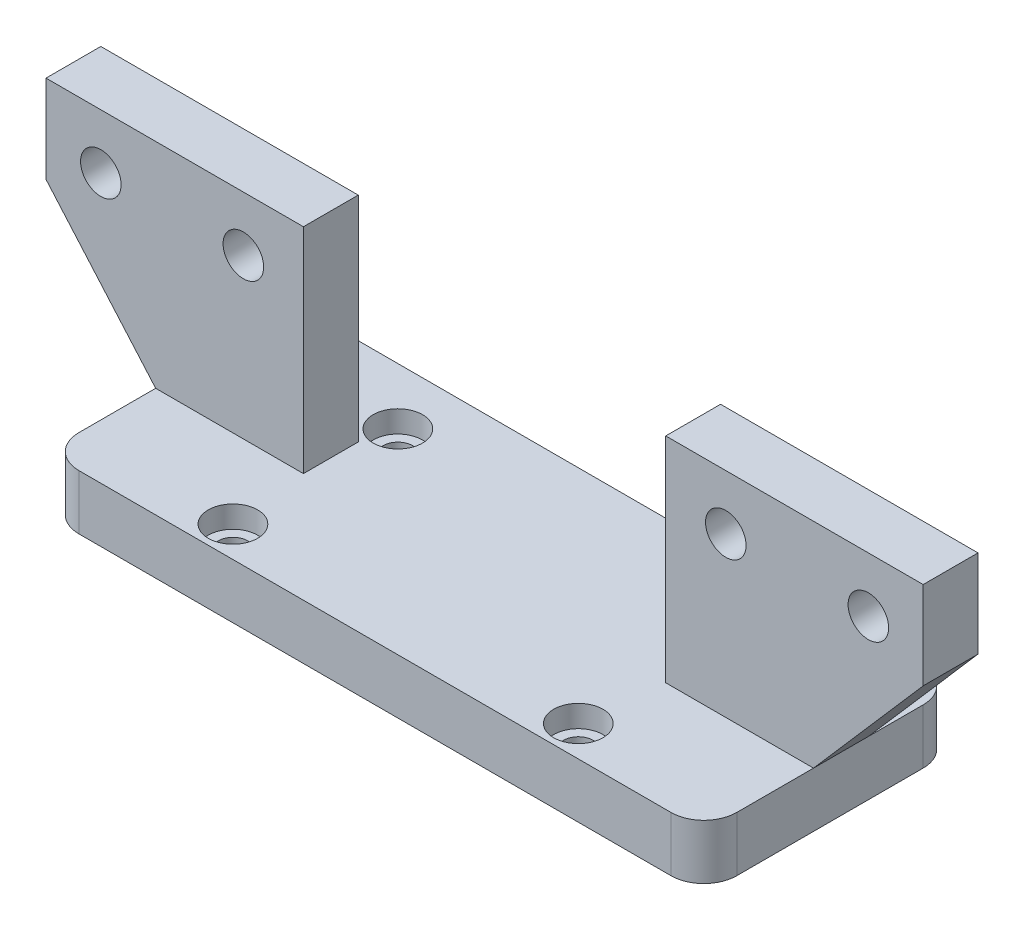
ISO-10303-21;
HEADER;
FILE_DESCRIPTION(('STEP AP214'),'2;1');
FILE_NAME('part.step','',(''),(''),'','','');
FILE_SCHEMA(('AUTOMOTIVE_DESIGN { 1 0 10303 214 1 1 1 1 }'));
ENDSEC;
DATA;
#1=APPLICATION_CONTEXT('core data for automotive mechanical design processes');
#2=APPLICATION_PROTOCOL_DEFINITION('international standard','automotive_design',2000,#1);
#3=PRODUCT_CONTEXT('',#1,'mechanical');
#4=PRODUCT('Part','Part','',(#3));
#5=PRODUCT_RELATED_PRODUCT_CATEGORY('part','',(#4));
#6=PRODUCT_DEFINITION_FORMATION('','',#4);
#7=PRODUCT_DEFINITION_CONTEXT('part definition',#1,'design');
#8=PRODUCT_DEFINITION('design','',#6,#7);
#9=PRODUCT_DEFINITION_SHAPE('','',#8);
#10=(LENGTH_UNIT() NAMED_UNIT(*) SI_UNIT(.MILLI.,.METRE.));
#11=(NAMED_UNIT(*) PLANE_ANGLE_UNIT() SI_UNIT($,.RADIAN.));
#12=(NAMED_UNIT(*) SI_UNIT($,.STERADIAN.) SOLID_ANGLE_UNIT());
#13=UNCERTAINTY_MEASURE_WITH_UNIT(LENGTH_MEASURE(1.E-05),#10,'distance_accuracy_value','');
#14=(GEOMETRIC_REPRESENTATION_CONTEXT(3) GLOBAL_UNCERTAINTY_ASSIGNED_CONTEXT((#13)) GLOBAL_UNIT_ASSIGNED_CONTEXT((#10,
#11,#12)) REPRESENTATION_CONTEXT('',''));
#15=CARTESIAN_POINT('',(0.,0.,0.));
#16=DIRECTION('',(0.,0.,1.));
#17=DIRECTION('',(1.,0.,0.));
#18=AXIS2_PLACEMENT_3D('',#15,#16,#17);
#19=CARTESIAN_POINT('',(-15.75,24.5,8.7));
#20=DIRECTION('',(0.,-1.,0.));
#21=DIRECTION('',(0.,0.,-1.));
#22=AXIS2_PLACEMENT_3D('',#19,#20,#21);
#23=CYLINDRICAL_SURFACE('',#22,1.35);
#24=CARTESIAN_POINT('',(-15.75,0.,8.7));
#25=DIRECTION('',(0.,-1.,0.));
#26=DIRECTION('',(0.,0.,-1.));
#27=AXIS2_PLACEMENT_3D('',#24,#25,#26);
#28=CIRCLE('',#27,1.35);
#29=CARTESIAN_POINT('',(-15.75,0.,7.35));
#30=VERTEX_POINT('',#29);
#31=EDGE_CURVE('E661',#30,#30,#28,.T.);
#32=ORIENTED_EDGE('',*,*,#31,.T.);
#33=EDGE_LOOP('',(#32));
#34=FACE_BOUND('',#33,.T.);
#35=CARTESIAN_POINT('',(-15.75,3.,8.7));
#36=DIRECTION('',(0.,1.,0.));
#37=DIRECTION('',(0.,0.,1.));
#38=AXIS2_PLACEMENT_3D('',#35,#36,#37);
#39=CIRCLE('',#38,1.35);
#40=CARTESIAN_POINT('',(-15.75,3.,10.05));
#41=VERTEX_POINT('',#40);
#42=EDGE_CURVE('E231',#41,#41,#39,.F.);
#43=ORIENTED_EDGE('',*,*,#42,.F.);
#44=EDGE_LOOP('',(#43));
#45=FACE_BOUND('',#44,.T.);
#46=ADVANCED_FACE('F34',(#34,#45),#23,.F.);
#47=CARTESIAN_POINT('',(15.75,24.5,8.7));
#48=DIRECTION('',(0.,-1.,0.));
#49=DIRECTION('',(0.,0.,-1.));
#50=AXIS2_PLACEMENT_3D('',#47,#48,#49);
#51=CYLINDRICAL_SURFACE('',#50,1.35);
#52=CARTESIAN_POINT('',(15.75,0.,8.7));
#53=DIRECTION('',(0.,-1.,0.));
#54=DIRECTION('',(0.,0.,-1.));
#55=AXIS2_PLACEMENT_3D('',#52,#53,#54);
#56=CIRCLE('',#55,1.35);
#57=CARTESIAN_POINT('',(15.75,0.,7.35));
#58=VERTEX_POINT('',#57);
#59=EDGE_CURVE('E657',#58,#58,#56,.T.);
#60=ORIENTED_EDGE('',*,*,#59,.T.);
#61=EDGE_LOOP('',(#60));
#62=FACE_BOUND('',#61,.T.);
#63=CARTESIAN_POINT('',(15.75,3.,8.7));
#64=DIRECTION('',(0.,1.,0.));
#65=DIRECTION('',(0.,0.,1.));
#66=AXIS2_PLACEMENT_3D('',#63,#64,#65);
#67=CIRCLE('',#66,1.35);
#68=CARTESIAN_POINT('',(15.75,3.,10.05));
#69=VERTEX_POINT('',#68);
#70=EDGE_CURVE('E228',#69,#69,#67,.F.);
#71=ORIENTED_EDGE('',*,*,#70,.F.);
#72=EDGE_LOOP('',(#71));
#73=FACE_BOUND('',#72,.T.);
#74=ADVANCED_FACE('F300',(#62,#73),#51,.F.);
#75=CARTESIAN_POINT('',(15.75,24.5,-6.34));
#76=DIRECTION('',(0.,-1.,0.));
#77=DIRECTION('',(0.,0.,-1.));
#78=AXIS2_PLACEMENT_3D('',#75,#76,#77);
#79=CYLINDRICAL_SURFACE('',#78,1.35);
#80=CARTESIAN_POINT('',(15.75,0.,-6.34));
#81=DIRECTION('',(0.,-1.,0.));
#82=DIRECTION('',(0.,0.,-1.));
#83=AXIS2_PLACEMENT_3D('',#80,#81,#82);
#84=CIRCLE('',#83,1.35);
#85=CARTESIAN_POINT('',(15.75,0.,-7.69));
#86=VERTEX_POINT('',#85);
#87=EDGE_CURVE('E654',#86,#86,#84,.T.);
#88=ORIENTED_EDGE('',*,*,#87,.T.);
#89=EDGE_LOOP('',(#88));
#90=FACE_BOUND('',#89,.T.);
#91=CARTESIAN_POINT('',(15.75,3.,-6.34));
#92=DIRECTION('',(0.,1.,0.));
#93=DIRECTION('',(0.,0.,1.));
#94=AXIS2_PLACEMENT_3D('',#91,#92,#93);
#95=CIRCLE('',#94,1.35);
#96=CARTESIAN_POINT('',(15.75,3.,-4.99));
#97=VERTEX_POINT('',#96);
#98=EDGE_CURVE('E224',#97,#97,#95,.F.);
#99=ORIENTED_EDGE('',*,*,#98,.F.);
#100=EDGE_LOOP('',(#99));
#101=FACE_BOUND('',#100,.T.);
#102=ADVANCED_FACE('F306',(#90,#101),#79,.F.);
#103=CARTESIAN_POINT('',(-15.75,24.5,-6.34));
#104=DIRECTION('',(0.,-1.,0.));
#105=DIRECTION('',(0.,0.,-1.));
#106=AXIS2_PLACEMENT_3D('',#103,#104,#105);
#107=CYLINDRICAL_SURFACE('',#106,1.35);
#108=CARTESIAN_POINT('',(-15.75,0.,-6.34));
#109=DIRECTION('',(0.,-1.,0.));
#110=DIRECTION('',(0.,0.,-1.));
#111=AXIS2_PLACEMENT_3D('',#108,#109,#110);
#112=CIRCLE('',#111,1.35);
#113=CARTESIAN_POINT('',(-15.75,0.,-7.69));
#114=VERTEX_POINT('',#113);
#115=EDGE_CURVE('E234',#114,#114,#112,.T.);
#116=ORIENTED_EDGE('',*,*,#115,.T.);
#117=EDGE_LOOP('',(#116));
#118=FACE_BOUND('',#117,.T.);
#119=CARTESIAN_POINT('',(-15.75,3.,-6.34));
#120=DIRECTION('',(0.,1.,0.));
#121=DIRECTION('',(0.,0.,1.));
#122=AXIS2_PLACEMENT_3D('',#119,#120,#121);
#123=CIRCLE('',#122,1.35);
#124=CARTESIAN_POINT('',(-15.75,3.,-4.99));
#125=VERTEX_POINT('',#124);
#126=EDGE_CURVE('E221',#125,#125,#123,.F.);
#127=ORIENTED_EDGE('',*,*,#126,.F.);
#128=EDGE_LOOP('',(#127));
#129=FACE_BOUND('',#128,.T.);
#130=ADVANCED_FACE('F313',(#118,#129),#107,.F.);
#131=CARTESIAN_POINT('',(0.,5.,0.));
#132=DIRECTION('',(0.,-1.,0.));
#133=DIRECTION('',(0.,0.,-1.));
#134=AXIS2_PLACEMENT_3D('',#131,#132,#133);
#135=PLANE('',#134);
#136=CARTESIAN_POINT('',(-15.75,5.,-6.34));
#137=DIRECTION('',(0.,1.,0.));
#138=DIRECTION('',(0.,0.,1.));
#139=AXIS2_PLACEMENT_3D('',#136,#137,#138);
#140=CIRCLE('',#139,2.25);
#141=CARTESIAN_POINT('',(-15.75,5.,-4.09));
#142=VERTEX_POINT('',#141);
#143=EDGE_CURVE('E790',#142,#142,#140,.T.);
#144=ORIENTED_EDGE('',*,*,#143,.F.);
#145=EDGE_LOOP('',(#144));
#146=FACE_BOUND('',#145,.T.);
#147=CARTESIAN_POINT('',(-15.75,5.,8.7));
#148=DIRECTION('',(0.,1.,0.));
#149=DIRECTION('',(0.,0.,1.));
#150=AXIS2_PLACEMENT_3D('',#147,#148,#149);
#151=CIRCLE('',#150,2.25);
#152=CARTESIAN_POINT('',(-15.75,5.,10.95));
#153=VERTEX_POINT('',#152);
#154=EDGE_CURVE('E796',#153,#153,#151,.T.);
#155=ORIENTED_EDGE('',*,*,#154,.F.);
#156=EDGE_LOOP('',(#155));
#157=FACE_BOUND('',#156,.T.);
#158=CARTESIAN_POINT('',(15.75,5.,8.7));
#159=DIRECTION('',(0.,1.,0.));
#160=DIRECTION('',(0.,0.,1.));
#161=AXIS2_PLACEMENT_3D('',#158,#159,#160);
#162=CIRCLE('',#161,2.25);
#163=CARTESIAN_POINT('',(15.75,5.,10.95));
#164=VERTEX_POINT('',#163);
#165=EDGE_CURVE('E802',#164,#164,#162,.T.);
#166=ORIENTED_EDGE('',*,*,#165,.F.);
#167=EDGE_LOOP('',(#166));
#168=FACE_BOUND('',#167,.T.);
#169=CARTESIAN_POINT('',(15.75,5.,-6.34));
#170=DIRECTION('',(0.,1.,0.));
#171=DIRECTION('',(0.,0.,1.));
#172=AXIS2_PLACEMENT_3D('',#169,#170,#171);
#173=CIRCLE('',#172,2.25);
#174=CARTESIAN_POINT('',(15.75,5.,-4.09));
#175=VERTEX_POINT('',#174);
#176=EDGE_CURVE('E784',#175,#175,#173,.T.);
#177=ORIENTED_EDGE('',*,*,#176,.F.);
#178=EDGE_LOOP('',(#177));
#179=FACE_BOUND('',#178,.T.);
#180=DIRECTION('',(0.,0.,-1.));
#181=VECTOR('',#180,1.);
#182=CARTESIAN_POINT('',(30.,5.,11.5));
#183=LINE('',#182,#181);
#184=CARTESIAN_POINT('',(30.,5.,-3.5));
#185=VERTEX_POINT('',#184);
#186=CARTESIAN_POINT('',(30.,5.,-8.5));
#187=VERTEX_POINT('',#186);
#188=EDGE_CURVE('E185',#185,#187,#183,.T.);
#189=ORIENTED_EDGE('',*,*,#188,.T.);
#190=CARTESIAN_POINT('',(27.,5.,-8.5));
#191=DIRECTION('',(0.,-1.,0.));
#192=DIRECTION('',(0.,0.,-1.));
#193=AXIS2_PLACEMENT_3D('',#190,#191,#192);
#194=CIRCLE('',#193,3.);
#195=CARTESIAN_POINT('',(27.,5.,-11.5));
#196=VERTEX_POINT('',#195);
#197=EDGE_CURVE('E256',#187,#196,#194,.F.);
#198=ORIENTED_EDGE('',*,*,#197,.T.);
#199=DIRECTION('',(-1.,0.,0.));
#200=VECTOR('',#199,1.);
#201=CARTESIAN_POINT('',(-30.,5.,-11.5));
#202=LINE('',#201,#200);
#203=CARTESIAN_POINT('',(-27.,5.,-11.5));
#204=VERTEX_POINT('',#203);
#205=EDGE_CURVE('E198',#196,#204,#202,.T.);
#206=ORIENTED_EDGE('',*,*,#205,.T.);
#207=CARTESIAN_POINT('',(-27.,5.,-8.5));
#208=DIRECTION('',(0.,-1.,0.));
#209=DIRECTION('',(0.,0.,-1.));
#210=AXIS2_PLACEMENT_3D('',#207,#208,#209);
#211=CIRCLE('',#210,3.);
#212=CARTESIAN_POINT('',(-30.,5.,-8.5));
#213=VERTEX_POINT('',#212);
#214=EDGE_CURVE('E254',#204,#213,#211,.F.);
#215=ORIENTED_EDGE('',*,*,#214,.T.);
#216=DIRECTION('',(0.,0.,1.));
#217=VECTOR('',#216,1.);
#218=CARTESIAN_POINT('',(-30.,5.,11.5));
#219=LINE('',#218,#217);
#220=CARTESIAN_POINT('',(-30.,5.,-3.5));
#221=VERTEX_POINT('',#220);
#222=EDGE_CURVE('E208',#213,#221,#219,.T.);
#223=ORIENTED_EDGE('',*,*,#222,.T.);
#224=DIRECTION('',(-1.,0.,0.));
#225=VECTOR('',#224,1.);
#226=CARTESIAN_POINT('',(0.,5.,-3.5));
#227=LINE('',#226,#225);
#228=CARTESIAN_POINT('',(-16.5216368519485,5.,-3.5));
#229=VERTEX_POINT('',#228);
#230=EDGE_CURVE('E700',#229,#221,#227,.T.);
#231=ORIENTED_EDGE('',*,*,#230,.F.);
#232=DIRECTION('',(0.,0.,1.));
#233=VECTOR('',#232,1.);
#234=CARTESIAN_POINT('',(-16.5216368519485,5.,-3.5));
#235=LINE('',#234,#233);
#236=CARTESIAN_POINT('',(-16.5216368519485,5.,1.5));
#237=VERTEX_POINT('',#236);
#238=EDGE_CURVE('E203',#229,#237,#235,.T.);
#239=ORIENTED_EDGE('',*,*,#238,.T.);
#240=DIRECTION('',(-1.,0.,0.));
#241=VECTOR('',#240,1.);
#242=CARTESIAN_POINT('',(0.,5.,1.5));
#243=LINE('',#242,#241);
#244=CARTESIAN_POINT('',(-30.,5.,1.5));
#245=VERTEX_POINT('',#244);
#246=EDGE_CURVE('E718',#237,#245,#243,.T.);
#247=ORIENTED_EDGE('',*,*,#246,.T.);
#248=CARTESIAN_POINT('',(-30.,5.,8.5));
#249=VERTEX_POINT('',#248);
#250=EDGE_CURVE('E207',#245,#249,#219,.T.);
#251=ORIENTED_EDGE('',*,*,#250,.T.);
#252=CARTESIAN_POINT('',(-27.,5.,8.5));
#253=DIRECTION('',(0.,-1.,0.));
#254=DIRECTION('',(0.,0.,-1.));
#255=AXIS2_PLACEMENT_3D('',#252,#253,#254);
#256=CIRCLE('',#255,3.);
#257=CARTESIAN_POINT('',(-27.,5.,11.5));
#258=VERTEX_POINT('',#257);
#259=EDGE_CURVE('E55',#249,#258,#256,.F.);
#260=ORIENTED_EDGE('',*,*,#259,.T.);
#261=DIRECTION('',(1.,0.,0.));
#262=VECTOR('',#261,1.);
#263=CARTESIAN_POINT('',(-30.,5.,11.5));
#264=LINE('',#263,#262);
#265=CARTESIAN_POINT('',(27.,5.,11.5));
#266=VERTEX_POINT('',#265);
#267=EDGE_CURVE('E210',#258,#266,#264,.T.);
#268=ORIENTED_EDGE('',*,*,#267,.T.);
#269=CARTESIAN_POINT('',(27.,5.,8.5));
#270=DIRECTION('',(0.,-1.,0.));
#271=DIRECTION('',(0.,0.,-1.));
#272=AXIS2_PLACEMENT_3D('',#269,#270,#271);
#273=CIRCLE('',#272,3.);
#274=CARTESIAN_POINT('',(30.,5.,8.5));
#275=VERTEX_POINT('',#274);
#276=EDGE_CURVE('E251',#266,#275,#273,.F.);
#277=ORIENTED_EDGE('',*,*,#276,.T.);
#278=CARTESIAN_POINT('',(30.,5.,1.5));
#279=VERTEX_POINT('',#278);
#280=EDGE_CURVE('E195',#275,#279,#183,.T.);
#281=ORIENTED_EDGE('',*,*,#280,.T.);
#282=DIRECTION('',(-1.,0.,0.));
#283=VECTOR('',#282,1.);
#284=CARTESIAN_POINT('',(0.,5.,1.5));
#285=LINE('',#284,#283);
#286=CARTESIAN_POINT('',(16.5216368519485,5.,1.5));
#287=VERTEX_POINT('',#286);
#288=EDGE_CURVE('E679',#279,#287,#285,.T.);
#289=ORIENTED_EDGE('',*,*,#288,.T.);
#290=DIRECTION('',(0.,0.,1.));
#291=VECTOR('',#290,1.);
#292=CARTESIAN_POINT('',(16.5216368519485,5.,-3.5));
#293=LINE('',#292,#291);
#294=CARTESIAN_POINT('',(16.5216368519485,5.,-3.5));
#295=VERTEX_POINT('',#294);
#296=EDGE_CURVE('E188',#295,#287,#293,.T.);
#297=ORIENTED_EDGE('',*,*,#296,.F.);
#298=DIRECTION('',(-1.,0.,0.));
#299=VECTOR('',#298,1.);
#300=CARTESIAN_POINT('',(0.,5.,-3.5));
#301=LINE('',#300,#299);
#302=EDGE_CURVE('E178',#185,#295,#301,.T.);
#303=ORIENTED_EDGE('',*,*,#302,.F.);
#304=EDGE_LOOP('',(#189,#198,#206,#215,#223,#231,#239,#247,#251,#260,#268,#277,#281,#289,#297,#303));
#305=FACE_BOUND('',#304,.T.);
#306=ADVANCED_FACE('F184',(#146,#157,#168,#179,#305),#135,.F.);
#307=CARTESIAN_POINT('',(30.,5.,11.5));
#308=DIRECTION('',(-1.,0.,0.));
#309=DIRECTION('',(0.,0.,1.));
#310=AXIS2_PLACEMENT_3D('',#307,#308,#309);
#311=PLANE('',#310);
#312=DIRECTION('',(0.,0.,-1.));
#313=VECTOR('',#312,1.);
#314=CARTESIAN_POINT('',(30.,0.,11.5));
#315=LINE('',#314,#313);
#316=CARTESIAN_POINT('',(30.,0.,8.5));
#317=VERTEX_POINT('',#316);
#318=CARTESIAN_POINT('',(30.,0.,-8.5));
#319=VERTEX_POINT('',#318);
#320=EDGE_CURVE('E213',#317,#319,#315,.T.);
#321=ORIENTED_EDGE('',*,*,#320,.T.);
#322=DIRECTION('',(0.,-1.,0.));
#323=VECTOR('',#322,1.);
#324=CARTESIAN_POINT('',(30.,5.,-8.5));
#325=LINE('',#324,#323);
#326=EDGE_CURVE('E194',#319,#187,#325,.F.);
#327=ORIENTED_EDGE('',*,*,#326,.T.);
#328=ORIENTED_EDGE('',*,*,#188,.F.);
#329=DIRECTION('',(0.,0.,1.));
#330=VECTOR('',#329,1.);
#331=CARTESIAN_POINT('',(30.,5.,-3.5));
#332=LINE('',#331,#330);
#333=EDGE_CURVE('E161',#185,#279,#332,.T.);
#334=ORIENTED_EDGE('',*,*,#333,.T.);
#335=ORIENTED_EDGE('',*,*,#280,.F.);
#336=DIRECTION('',(0.,-1.,0.));
#337=VECTOR('',#336,1.);
#338=CARTESIAN_POINT('',(30.,5.,8.5));
#339=LINE('',#338,#337);
#340=EDGE_CURVE('E247',#275,#317,#339,.T.);
#341=ORIENTED_EDGE('',*,*,#340,.T.);
#342=EDGE_LOOP('',(#321,#327,#328,#334,#335,#341));
#343=FACE_BOUND('',#342,.T.);
#344=ADVANCED_FACE('F192',(#343),#311,.F.);
#345=CARTESIAN_POINT('',(-30.,5.,-11.5));
#346=DIRECTION('',(0.,0.,1.));
#347=DIRECTION('',(1.,0.,0.));
#348=AXIS2_PLACEMENT_3D('',#345,#346,#347);
#349=PLANE('',#348);
#350=ORIENTED_EDGE('',*,*,#205,.F.);
#351=DIRECTION('',(0.,-1.,0.));
#352=VECTOR('',#351,1.);
#353=CARTESIAN_POINT('',(27.,5.,-11.5));
#354=LINE('',#353,#352);
#355=CARTESIAN_POINT('',(27.,0.,-11.5));
#356=VERTEX_POINT('',#355);
#357=EDGE_CURVE('E236',#196,#356,#354,.T.);
#358=ORIENTED_EDGE('',*,*,#357,.T.);
#359=DIRECTION('',(-1.,0.,0.));
#360=VECTOR('',#359,1.);
#361=CARTESIAN_POINT('',(-30.,0.,-11.5));
#362=LINE('',#361,#360);
#363=CARTESIAN_POINT('',(-27.,0.,-11.5));
#364=VERTEX_POINT('',#363);
#365=EDGE_CURVE('E215',#356,#364,#362,.T.);
#366=ORIENTED_EDGE('',*,*,#365,.T.);
#367=DIRECTION('',(0.,-1.,0.));
#368=VECTOR('',#367,1.);
#369=CARTESIAN_POINT('',(-27.,5.,-11.5));
#370=LINE('',#369,#368);
#371=EDGE_CURVE('E212',#364,#204,#370,.F.);
#372=ORIENTED_EDGE('',*,*,#371,.T.);
#373=EDGE_LOOP('',(#350,#358,#366,#372));
#374=FACE_BOUND('',#373,.T.);
#375=ADVANCED_FACE('F288',(#374),#349,.F.);
#376=CARTESIAN_POINT('',(-30.,5.,11.5));
#377=DIRECTION('',(1.,0.,0.));
#378=DIRECTION('',(0.,0.,-1.));
#379=AXIS2_PLACEMENT_3D('',#376,#377,#378);
#380=PLANE('',#379);
#381=ORIENTED_EDGE('',*,*,#222,.F.);
#382=DIRECTION('',(0.,-1.,0.));
#383=VECTOR('',#382,1.);
#384=CARTESIAN_POINT('',(-30.,5.,-8.5));
#385=LINE('',#384,#383);
#386=CARTESIAN_POINT('',(-30.,0.,-8.5));
#387=VERTEX_POINT('',#386);
#388=EDGE_CURVE('E260',#213,#387,#385,.T.);
#389=ORIENTED_EDGE('',*,*,#388,.T.);
#390=DIRECTION('',(0.,0.,1.));
#391=VECTOR('',#390,1.);
#392=CARTESIAN_POINT('',(-30.,0.,11.5));
#393=LINE('',#392,#391);
#394=CARTESIAN_POINT('',(-30.,0.,8.5));
#395=VERTEX_POINT('',#394);
#396=EDGE_CURVE('E199',#387,#395,#393,.T.);
#397=ORIENTED_EDGE('',*,*,#396,.T.);
#398=DIRECTION('',(0.,-1.,0.));
#399=VECTOR('',#398,1.);
#400=CARTESIAN_POINT('',(-30.,5.,8.5));
#401=LINE('',#400,#399);
#402=EDGE_CURVE('E258',#395,#249,#401,.F.);
#403=ORIENTED_EDGE('',*,*,#402,.T.);
#404=ORIENTED_EDGE('',*,*,#250,.F.);
#405=DIRECTION('',(0.,0.,1.));
#406=VECTOR('',#405,1.);
#407=CARTESIAN_POINT('',(-30.,5.,-3.5));
#408=LINE('',#407,#406);
#409=EDGE_CURVE('E216',#221,#245,#408,.T.);
#410=ORIENTED_EDGE('',*,*,#409,.F.);
#411=EDGE_LOOP('',(#381,#389,#397,#403,#404,#410));
#412=FACE_BOUND('',#411,.T.);
#413=ADVANCED_FACE('F266',(#412),#380,.F.);
#414=CARTESIAN_POINT('',(-30.,5.,11.5));
#415=DIRECTION('',(0.,0.,-1.));
#416=DIRECTION('',(-1.,0.,0.));
#417=AXIS2_PLACEMENT_3D('',#414,#415,#416);
#418=PLANE('',#417);
#419=ORIENTED_EDGE('',*,*,#267,.F.);
#420=DIRECTION('',(0.,-1.,0.));
#421=VECTOR('',#420,1.);
#422=CARTESIAN_POINT('',(-27.,5.,11.5));
#423=LINE('',#422,#421);
#424=CARTESIAN_POINT('',(-27.,0.,11.5));
#425=VERTEX_POINT('',#424);
#426=EDGE_CURVE('E11',#258,#425,#423,.T.);
#427=ORIENTED_EDGE('',*,*,#426,.T.);
#428=DIRECTION('',(1.,0.,0.));
#429=VECTOR('',#428,1.);
#430=CARTESIAN_POINT('',(-30.,0.,11.5));
#431=LINE('',#430,#429);
#432=CARTESIAN_POINT('',(27.,0.,11.5));
#433=VERTEX_POINT('',#432);
#434=EDGE_CURVE('E196',#425,#433,#431,.T.);
#435=ORIENTED_EDGE('',*,*,#434,.T.);
#436=DIRECTION('',(0.,-1.,0.));
#437=VECTOR('',#436,1.);
#438=CARTESIAN_POINT('',(27.,5.,11.5));
#439=LINE('',#438,#437);
#440=EDGE_CURVE('E42',#433,#266,#439,.F.);
#441=ORIENTED_EDGE('',*,*,#440,.T.);
#442=EDGE_LOOP('',(#419,#427,#435,#441));
#443=FACE_BOUND('',#442,.T.);
#444=ADVANCED_FACE('F278',(#443),#418,.F.);
#445=CARTESIAN_POINT('',(0.,0.,0.));
#446=DIRECTION('',(0.,-1.,0.));
#447=DIRECTION('',(0.,0.,-1.));
#448=AXIS2_PLACEMENT_3D('',#445,#446,#447);
#449=PLANE('',#448);
#450=ORIENTED_EDGE('',*,*,#115,.F.);
#451=EDGE_LOOP('',(#450));
#452=FACE_BOUND('',#451,.T.);
#453=ORIENTED_EDGE('',*,*,#87,.F.);
#454=EDGE_LOOP('',(#453));
#455=FACE_BOUND('',#454,.T.);
#456=ORIENTED_EDGE('',*,*,#59,.F.);
#457=EDGE_LOOP('',(#456));
#458=FACE_BOUND('',#457,.T.);
#459=ORIENTED_EDGE('',*,*,#31,.F.);
#460=EDGE_LOOP('',(#459));
#461=FACE_BOUND('',#460,.T.);
#462=ORIENTED_EDGE('',*,*,#365,.F.);
#463=CARTESIAN_POINT('',(27.,0.,-8.5));
#464=DIRECTION('',(0.,-1.,0.));
#465=DIRECTION('',(0.,0.,-1.));
#466=AXIS2_PLACEMENT_3D('',#463,#464,#465);
#467=CIRCLE('',#466,3.);
#468=EDGE_CURVE('E245',#356,#319,#467,.T.);
#469=ORIENTED_EDGE('',*,*,#468,.T.);
#470=ORIENTED_EDGE('',*,*,#320,.F.);
#471=CARTESIAN_POINT('',(27.,0.,8.5));
#472=DIRECTION('',(0.,-1.,0.));
#473=DIRECTION('',(0.,0.,-1.));
#474=AXIS2_PLACEMENT_3D('',#471,#472,#473);
#475=CIRCLE('',#474,3.);
#476=EDGE_CURVE('E239',#317,#433,#475,.T.);
#477=ORIENTED_EDGE('',*,*,#476,.T.);
#478=ORIENTED_EDGE('',*,*,#434,.F.);
#479=CARTESIAN_POINT('',(-27.,0.,8.5));
#480=DIRECTION('',(0.,-1.,0.));
#481=DIRECTION('',(0.,0.,-1.));
#482=AXIS2_PLACEMENT_3D('',#479,#480,#481);
#483=CIRCLE('',#482,3.);
#484=EDGE_CURVE('E241',#425,#395,#483,.T.);
#485=ORIENTED_EDGE('',*,*,#484,.T.);
#486=ORIENTED_EDGE('',*,*,#396,.F.);
#487=CARTESIAN_POINT('',(-27.,0.,-8.5));
#488=DIRECTION('',(0.,-1.,0.));
#489=DIRECTION('',(0.,0.,-1.));
#490=AXIS2_PLACEMENT_3D('',#487,#488,#489);
#491=CIRCLE('',#490,3.);
#492=EDGE_CURVE('E243',#387,#364,#491,.T.);
#493=ORIENTED_EDGE('',*,*,#492,.T.);
#494=EDGE_LOOP('',(#462,#469,#470,#477,#478,#485,#486,#493));
#495=FACE_BOUND('',#494,.T.);
#496=ADVANCED_FACE('F273',(#452,#455,#458,#461,#495),#449,.T.);
#497=CARTESIAN_POINT('',(-14.6071044133477,-12.7018299246502,-3.5));
#498=DIRECTION('',(-0.754605522163505,-0.656178714924787,0.));
#499=DIRECTION('',(0.656178714924787,-0.754605522163505,0.));
#500=AXIS2_PLACEMENT_3D('',#497,#498,#499);
#501=PLANE('',#500);
#502=DIRECTION('',(0.656178714924787,-0.754605522163505,0.));
#503=VECTOR('',#502,1.);
#504=CARTESIAN_POINT('',(-14.6071044133477,-12.7018299246502,1.5));
#505=LINE('',#504,#503);
#506=CARTESIAN_POINT('',(-40.,16.5,1.5));
#507=VERTEX_POINT('',#506);
#508=EDGE_CURVE('E728',#507,#245,#505,.T.);
#509=ORIENTED_EDGE('',*,*,#508,.F.);
#510=DIRECTION('',(0.,0.,1.));
#511=VECTOR('',#510,1.);
#512=CARTESIAN_POINT('',(-40.,16.5,-3.5));
#513=LINE('',#512,#511);
#514=CARTESIAN_POINT('',(-40.,16.5,-3.5));
#515=VERTEX_POINT('',#514);
#516=EDGE_CURVE('E734',#515,#507,#513,.T.);
#517=ORIENTED_EDGE('',*,*,#516,.F.);
#518=DIRECTION('',(0.656178714924787,-0.754605522163505,0.));
#519=VECTOR('',#518,1.);
#520=CARTESIAN_POINT('',(-14.6071044133477,-12.7018299246502,-3.5));
#521=LINE('',#520,#519);
#522=EDGE_CURVE('E710',#515,#221,#521,.T.);
#523=ORIENTED_EDGE('',*,*,#522,.T.);
#524=ORIENTED_EDGE('',*,*,#409,.T.);
#525=EDGE_LOOP('',(#509,#517,#523,#524));
#526=FACE_BOUND('',#525,.T.);
#527=ADVANCED_FACE('F358',(#526),#501,.T.);
#528=CARTESIAN_POINT('',(-40.,0.,-3.5));
#529=DIRECTION('',(1.,0.,0.));
#530=DIRECTION('',(0.,0.,-1.));
#531=AXIS2_PLACEMENT_3D('',#528,#529,#530);
#532=PLANE('',#531);
#533=DIRECTION('',(0.,1.,0.));
#534=VECTOR('',#533,1.);
#535=CARTESIAN_POINT('',(-40.,0.,1.5));
#536=LINE('',#535,#534);
#537=CARTESIAN_POINT('',(-40.,24.5,1.5));
#538=VERTEX_POINT('',#537);
#539=EDGE_CURVE('E726',#507,#538,#536,.T.);
#540=ORIENTED_EDGE('',*,*,#539,.T.);
#541=DIRECTION('',(0.,0.,1.));
#542=VECTOR('',#541,1.);
#543=CARTESIAN_POINT('',(-40.,24.5,-3.5));
#544=LINE('',#543,#542);
#545=CARTESIAN_POINT('',(-40.,24.5,-3.5));
#546=VERTEX_POINT('',#545);
#547=EDGE_CURVE('E736',#546,#538,#544,.T.);
#548=ORIENTED_EDGE('',*,*,#547,.F.);
#549=DIRECTION('',(0.,1.,0.));
#550=VECTOR('',#549,1.);
#551=CARTESIAN_POINT('',(-40.,0.,-3.5));
#552=LINE('',#551,#550);
#553=EDGE_CURVE('E708',#515,#546,#552,.T.);
#554=ORIENTED_EDGE('',*,*,#553,.F.);
#555=ORIENTED_EDGE('',*,*,#516,.T.);
#556=EDGE_LOOP('',(#540,#548,#554,#555));
#557=FACE_BOUND('',#556,.T.);
#558=ADVANCED_FACE('F361',(#557),#532,.F.);
#559=CARTESIAN_POINT('',(0.,24.5,-3.5));
#560=DIRECTION('',(0.,-1.,0.));
#561=DIRECTION('',(0.,0.,-1.));
#562=AXIS2_PLACEMENT_3D('',#559,#560,#561);
#563=PLANE('',#562);
#564=DIRECTION('',(1.,0.,0.));
#565=VECTOR('',#564,1.);
#566=CARTESIAN_POINT('',(0.,24.5,1.5));
#567=LINE('',#566,#565);
#568=CARTESIAN_POINT('',(-16.5216368519485,24.5,1.5));
#569=VERTEX_POINT('',#568);
#570=EDGE_CURVE('E724',#538,#569,#567,.T.);
#571=ORIENTED_EDGE('',*,*,#570,.T.);
#572=DIRECTION('',(0.,0.,1.));
#573=VECTOR('',#572,1.);
#574=CARTESIAN_POINT('',(-16.5216368519485,24.5,-3.5));
#575=LINE('',#574,#573);
#576=CARTESIAN_POINT('',(-16.5216368519485,24.5,-3.5));
#577=VERTEX_POINT('',#576);
#578=EDGE_CURVE('E738',#577,#569,#575,.T.);
#579=ORIENTED_EDGE('',*,*,#578,.F.);
#580=DIRECTION('',(1.,0.,0.));
#581=VECTOR('',#580,1.);
#582=CARTESIAN_POINT('',(0.,24.5,-3.5));
#583=LINE('',#582,#581);
#584=EDGE_CURVE('E706',#546,#577,#583,.T.);
#585=ORIENTED_EDGE('',*,*,#584,.F.);
#586=ORIENTED_EDGE('',*,*,#547,.T.);
#587=EDGE_LOOP('',(#571,#579,#585,#586));
#588=FACE_BOUND('',#587,.T.);
#589=ADVANCED_FACE('F365',(#588),#563,.F.);
#590=CARTESIAN_POINT('',(-16.5216368519485,0.,-3.5));
#591=DIRECTION('',(-1.,0.,0.));
#592=DIRECTION('',(0.,-1.,0.));
#593=AXIS2_PLACEMENT_3D('',#590,#591,#592);
#594=PLANE('',#593);
#595=DIRECTION('',(0.,-1.,0.));
#596=VECTOR('',#595,1.);
#597=CARTESIAN_POINT('',(-16.5216368519485,0.,1.5));
#598=LINE('',#597,#596);
#599=EDGE_CURVE('E721',#569,#237,#598,.T.);
#600=ORIENTED_EDGE('',*,*,#599,.T.);
#601=ORIENTED_EDGE('',*,*,#238,.F.);
#602=DIRECTION('',(0.,-1.,0.));
#603=VECTOR('',#602,1.);
#604=CARTESIAN_POINT('',(-16.5216368519485,0.,-3.5));
#605=LINE('',#604,#603);
#606=EDGE_CURVE('E704',#577,#229,#605,.T.);
#607=ORIENTED_EDGE('',*,*,#606,.F.);
#608=ORIENTED_EDGE('',*,*,#578,.T.);
#609=EDGE_LOOP('',(#600,#601,#607,#608));
#610=FACE_BOUND('',#609,.T.);
#611=ADVANCED_FACE('F369',(#610),#594,.F.);
#612=CARTESIAN_POINT('',(-22.,19.5,-3.5));
#613=DIRECTION('',(0.,0.,1.));
#614=DIRECTION('',(1.,0.,0.));
#615=AXIS2_PLACEMENT_3D('',#612,#613,#614);
#616=CYLINDRICAL_SURFACE('',#615,1.85);
#617=CARTESIAN_POINT('',(-22.,19.5,-3.5));
#618=DIRECTION('',(0.,0.,1.));
#619=DIRECTION('',(1.,0.,0.));
#620=AXIS2_PLACEMENT_3D('',#617,#618,#619);
#621=CIRCLE('',#620,1.85);
#622=CARTESIAN_POINT('',(-20.15,19.5,-3.5));
#623=VERTEX_POINT('',#622);
#624=EDGE_CURVE('E697',#623,#623,#621,.T.);
#625=ORIENTED_EDGE('',*,*,#624,.F.);
#626=EDGE_LOOP('',(#625));
#627=FACE_BOUND('',#626,.T.);
#628=CARTESIAN_POINT('',(-22.,19.5,1.5));
#629=DIRECTION('',(0.,0.,1.));
#630=DIRECTION('',(1.,0.,0.));
#631=AXIS2_PLACEMENT_3D('',#628,#629,#630);
#632=CIRCLE('',#631,1.85);
#633=CARTESIAN_POINT('',(-20.15,19.5,1.5));
#634=VERTEX_POINT('',#633);
#635=EDGE_CURVE('E690',#634,#634,#632,.T.);
#636=ORIENTED_EDGE('',*,*,#635,.T.);
#637=EDGE_LOOP('',(#636));
#638=FACE_BOUND('',#637,.T.);
#639=ADVANCED_FACE('F356',(#627,#638),#616,.F.);
#640=CARTESIAN_POINT('',(-35.,19.5,-3.5));
#641=DIRECTION('',(0.,0.,1.));
#642=DIRECTION('',(1.,0.,0.));
#643=AXIS2_PLACEMENT_3D('',#640,#641,#642);
#644=CYLINDRICAL_SURFACE('',#643,1.85);
#645=CARTESIAN_POINT('',(-35.,19.5,-3.5));
#646=DIRECTION('',(0.,0.,1.));
#647=DIRECTION('',(1.,0.,0.));
#648=AXIS2_PLACEMENT_3D('',#645,#646,#647);
#649=CIRCLE('',#648,1.85);
#650=CARTESIAN_POINT('',(-33.15,19.5,-3.5));
#651=VERTEX_POINT('',#650);
#652=EDGE_CURVE('E713',#651,#651,#649,.T.);
#653=ORIENTED_EDGE('',*,*,#652,.F.);
#654=EDGE_LOOP('',(#653));
#655=FACE_BOUND('',#654,.T.);
#656=CARTESIAN_POINT('',(-35.,19.5,1.5));
#657=DIRECTION('',(0.,0.,1.));
#658=DIRECTION('',(1.,0.,0.));
#659=AXIS2_PLACEMENT_3D('',#656,#657,#658);
#660=CIRCLE('',#659,1.85);
#661=CARTESIAN_POINT('',(-33.15,19.5,1.5));
#662=VERTEX_POINT('',#661);
#663=EDGE_CURVE('E701',#662,#662,#660,.T.);
#664=ORIENTED_EDGE('',*,*,#663,.T.);
#665=EDGE_LOOP('',(#664));
#666=FACE_BOUND('',#665,.T.);
#667=ADVANCED_FACE('F349',(#655,#666),#644,.F.);
#668=CARTESIAN_POINT('',(0.,0.,-3.5));
#669=DIRECTION('',(0.,0.,1.));
#670=DIRECTION('',(1.,0.,0.));
#671=AXIS2_PLACEMENT_3D('',#668,#669,#670);
#672=PLANE('',#671);
#673=ORIENTED_EDGE('',*,*,#624,.T.);
#674=EDGE_LOOP('',(#673));
#675=FACE_BOUND('',#674,.T.);
#676=ORIENTED_EDGE('',*,*,#230,.T.);
#677=ORIENTED_EDGE('',*,*,#522,.F.);
#678=ORIENTED_EDGE('',*,*,#553,.T.);
#679=ORIENTED_EDGE('',*,*,#584,.T.);
#680=ORIENTED_EDGE('',*,*,#606,.T.);
#681=EDGE_LOOP('',(#676,#677,#678,#679,#680));
#682=FACE_BOUND('',#681,.T.);
#683=ORIENTED_EDGE('',*,*,#652,.T.);
#684=EDGE_LOOP('',(#683));
#685=FACE_BOUND('',#684,.T.);
#686=ADVANCED_FACE('F346',(#675,#682,#685),#672,.F.);
#687=CARTESIAN_POINT('',(0.,0.,1.5));
#688=DIRECTION('',(0.,0.,1.));
#689=DIRECTION('',(1.,0.,0.));
#690=AXIS2_PLACEMENT_3D('',#687,#688,#689);
#691=PLANE('',#690);
#692=ORIENTED_EDGE('',*,*,#635,.F.);
#693=EDGE_LOOP('',(#692));
#694=FACE_BOUND('',#693,.T.);
#695=ORIENTED_EDGE('',*,*,#246,.F.);
#696=ORIENTED_EDGE('',*,*,#599,.F.);
#697=ORIENTED_EDGE('',*,*,#570,.F.);
#698=ORIENTED_EDGE('',*,*,#539,.F.);
#699=ORIENTED_EDGE('',*,*,#508,.T.);
#700=EDGE_LOOP('',(#695,#696,#697,#698,#699));
#701=FACE_BOUND('',#700,.T.);
#702=ORIENTED_EDGE('',*,*,#663,.F.);
#703=EDGE_LOOP('',(#702));
#704=FACE_BOUND('',#703,.T.);
#705=ADVANCED_FACE('F327',(#694,#701,#704),#691,.T.);
#706=CARTESIAN_POINT('',(16.5216368519485,0.,-3.5));
#707=DIRECTION('',(1.,0.,0.));
#708=DIRECTION('',(0.,1.,0.));
#709=AXIS2_PLACEMENT_3D('',#706,#707,#708);
#710=PLANE('',#709);
#711=DIRECTION('',(0.,1.,0.));
#712=VECTOR('',#711,1.);
#713=CARTESIAN_POINT('',(16.5216368519485,0.,1.5));
#714=LINE('',#713,#712);
#715=CARTESIAN_POINT('',(16.5216368519485,24.5,1.5));
#716=VERTEX_POINT('',#715);
#717=EDGE_CURVE('E667',#287,#716,#714,.T.);
#718=ORIENTED_EDGE('',*,*,#717,.T.);
#719=DIRECTION('',(0.,0.,1.));
#720=VECTOR('',#719,1.);
#721=CARTESIAN_POINT('',(16.5216368519485,24.5,-3.5));
#722=LINE('',#721,#720);
#723=CARTESIAN_POINT('',(16.5216368519485,24.5,-3.5));
#724=VERTEX_POINT('',#723);
#725=EDGE_CURVE('E691',#724,#716,#722,.T.);
#726=ORIENTED_EDGE('',*,*,#725,.F.);
#727=DIRECTION('',(0.,1.,0.));
#728=VECTOR('',#727,1.);
#729=CARTESIAN_POINT('',(16.5216368519485,0.,-3.5));
#730=LINE('',#729,#728);
#731=EDGE_CURVE('E171',#295,#724,#730,.T.);
#732=ORIENTED_EDGE('',*,*,#731,.F.);
#733=ORIENTED_EDGE('',*,*,#296,.T.);
#734=EDGE_LOOP('',(#718,#726,#732,#733));
#735=FACE_BOUND('',#734,.T.);
#736=ADVANCED_FACE('F323',(#735),#710,.F.);
#737=CARTESIAN_POINT('',(0.,24.5,-3.5));
#738=DIRECTION('',(0.,-1.,0.));
#739=DIRECTION('',(1.,0.,0.));
#740=AXIS2_PLACEMENT_3D('',#737,#738,#739);
#741=PLANE('',#740);
#742=DIRECTION('',(1.,0.,0.));
#743=VECTOR('',#742,1.);
#744=CARTESIAN_POINT('',(0.,24.5,1.5));
#745=LINE('',#744,#743);
#746=CARTESIAN_POINT('',(40.,24.5,1.5));
#747=VERTEX_POINT('',#746);
#748=EDGE_CURVE('E685',#716,#747,#745,.T.);
#749=ORIENTED_EDGE('',*,*,#748,.T.);
#750=DIRECTION('',(0.,0.,1.));
#751=VECTOR('',#750,1.);
#752=CARTESIAN_POINT('',(40.,24.5,-3.5));
#753=LINE('',#752,#751);
#754=CARTESIAN_POINT('',(40.,24.5,-3.5));
#755=VERTEX_POINT('',#754);
#756=EDGE_CURVE('E694',#755,#747,#753,.T.);
#757=ORIENTED_EDGE('',*,*,#756,.F.);
#758=DIRECTION('',(1.,0.,0.));
#759=VECTOR('',#758,1.);
#760=CARTESIAN_POINT('',(0.,24.5,-3.5));
#761=LINE('',#760,#759);
#762=EDGE_CURVE('E671',#724,#755,#761,.T.);
#763=ORIENTED_EDGE('',*,*,#762,.F.);
#764=ORIENTED_EDGE('',*,*,#725,.T.);
#765=EDGE_LOOP('',(#749,#757,#763,#764));
#766=FACE_BOUND('',#765,.T.);
#767=ADVANCED_FACE('F326',(#766),#741,.F.);
#768=CARTESIAN_POINT('',(40.,0.,-3.5));
#769=DIRECTION('',(1.,0.,0.));
#770=DIRECTION('',(0.,0.,-1.));
#771=AXIS2_PLACEMENT_3D('',#768,#769,#770);
#772=PLANE('',#771);
#773=DIRECTION('',(0.,1.,0.));
#774=VECTOR('',#773,1.);
#775=CARTESIAN_POINT('',(40.,0.,1.5));
#776=LINE('',#775,#774);
#777=CARTESIAN_POINT('',(40.,16.5,1.5));
#778=VERTEX_POINT('',#777);
#779=EDGE_CURVE('E682',#778,#747,#776,.T.);
#780=ORIENTED_EDGE('',*,*,#779,.F.);
#781=DIRECTION('',(0.,0.,1.));
#782=VECTOR('',#781,1.);
#783=CARTESIAN_POINT('',(40.,16.5,-3.5));
#784=LINE('',#783,#782);
#785=CARTESIAN_POINT('',(40.,16.5,-3.5));
#786=VERTEX_POINT('',#785);
#787=EDGE_CURVE('E170',#786,#778,#784,.T.);
#788=ORIENTED_EDGE('',*,*,#787,.F.);
#789=DIRECTION('',(0.,1.,0.));
#790=VECTOR('',#789,1.);
#791=CARTESIAN_POINT('',(40.,0.,-3.5));
#792=LINE('',#791,#790);
#793=EDGE_CURVE('E181',#786,#755,#792,.T.);
#794=ORIENTED_EDGE('',*,*,#793,.T.);
#795=ORIENTED_EDGE('',*,*,#756,.T.);
#796=EDGE_LOOP('',(#780,#788,#794,#795));
#797=FACE_BOUND('',#796,.T.);
#798=ADVANCED_FACE('F331',(#797),#772,.T.);
#799=CARTESIAN_POINT('',(35.,19.5,-3.5));
#800=DIRECTION('',(0.,0.,1.));
#801=DIRECTION('',(1.,0.,0.));
#802=AXIS2_PLACEMENT_3D('',#799,#800,#801);
#803=CYLINDRICAL_SURFACE('',#802,1.85);
#804=CARTESIAN_POINT('',(35.,19.5,-3.5));
#805=DIRECTION('',(0.,0.,1.));
#806=DIRECTION('',(1.,0.,0.));
#807=AXIS2_PLACEMENT_3D('',#804,#805,#806);
#808=CIRCLE('',#807,1.85);
#809=CARTESIAN_POINT('',(36.85,19.5,-3.5));
#810=VERTEX_POINT('',#809);
#811=EDGE_CURVE('E189',#810,#810,#808,.T.);
#812=ORIENTED_EDGE('',*,*,#811,.F.);
#813=EDGE_LOOP('',(#812));
#814=FACE_BOUND('',#813,.T.);
#815=CARTESIAN_POINT('',(35.,19.5,1.5));
#816=DIRECTION('',(0.,0.,1.));
#817=DIRECTION('',(1.,0.,0.));
#818=AXIS2_PLACEMENT_3D('',#815,#816,#817);
#819=CIRCLE('',#818,1.85);
#820=CARTESIAN_POINT('',(36.85,19.5,1.5));
#821=VERTEX_POINT('',#820);
#822=EDGE_CURVE('E676',#821,#821,#819,.T.);
#823=ORIENTED_EDGE('',*,*,#822,.T.);
#824=EDGE_LOOP('',(#823));
#825=FACE_BOUND('',#824,.T.);
#826=ADVANCED_FACE('F335',(#814,#825),#803,.F.);
#827=CARTESIAN_POINT('',(22.,19.5,-3.5));
#828=DIRECTION('',(0.,0.,1.));
#829=DIRECTION('',(1.,0.,0.));
#830=AXIS2_PLACEMENT_3D('',#827,#828,#829);
#831=CYLINDRICAL_SURFACE('',#830,1.85);
#832=CARTESIAN_POINT('',(22.,19.5,-3.5));
#833=DIRECTION('',(0.,0.,1.));
#834=DIRECTION('',(1.,0.,0.));
#835=AXIS2_PLACEMENT_3D('',#832,#833,#834);
#836=CIRCLE('',#835,1.85);
#837=CARTESIAN_POINT('',(23.85,19.5,-3.5));
#838=VERTEX_POINT('',#837);
#839=EDGE_CURVE('E664',#838,#838,#836,.T.);
#840=ORIENTED_EDGE('',*,*,#839,.F.);
#841=EDGE_LOOP('',(#840));
#842=FACE_BOUND('',#841,.T.);
#843=CARTESIAN_POINT('',(22.,19.5,1.5));
#844=DIRECTION('',(0.,0.,1.));
#845=DIRECTION('',(1.,0.,0.));
#846=AXIS2_PLACEMENT_3D('',#843,#844,#845);
#847=CIRCLE('',#846,1.85);
#848=CARTESIAN_POINT('',(23.85,19.5,1.5));
#849=VERTEX_POINT('',#848);
#850=EDGE_CURVE('E663',#849,#849,#847,.T.);
#851=ORIENTED_EDGE('',*,*,#850,.T.);
#852=EDGE_LOOP('',(#851));
#853=FACE_BOUND('',#852,.T.);
#854=ADVANCED_FACE('F339',(#842,#853),#831,.F.);
#855=CARTESIAN_POINT('',(14.6071044133477,-12.7018299246502,-3.5));
#856=DIRECTION('',(0.754605522163505,-0.656178714924787,0.));
#857=DIRECTION('',(0.656178714924787,0.754605522163505,0.));
#858=AXIS2_PLACEMENT_3D('',#855,#856,#857);
#859=PLANE('',#858);
#860=DIRECTION('',(0.656178714924787,0.754605522163505,0.));
#861=VECTOR('',#860,1.);
#862=CARTESIAN_POINT('',(14.6071044133477,-12.7018299246502,1.5));
#863=LINE('',#862,#861);
#864=EDGE_CURVE('E166',#279,#778,#863,.T.);
#865=ORIENTED_EDGE('',*,*,#864,.F.);
#866=ORIENTED_EDGE('',*,*,#333,.F.);
#867=DIRECTION('',(0.656178714924787,0.754605522163505,0.));
#868=VECTOR('',#867,1.);
#869=CARTESIAN_POINT('',(14.6071044133477,-12.7018299246502,-3.5));
#870=LINE('',#869,#868);
#871=EDGE_CURVE('E164',#185,#786,#870,.T.);
#872=ORIENTED_EDGE('',*,*,#871,.T.);
#873=ORIENTED_EDGE('',*,*,#787,.T.);
#874=EDGE_LOOP('',(#865,#866,#872,#873));
#875=FACE_BOUND('',#874,.T.);
#876=ADVANCED_FACE('F163',(#875),#859,.T.);
#877=CARTESIAN_POINT('',(0.,0.,-3.5));
#878=DIRECTION('',(0.,0.,1.));
#879=DIRECTION('',(1.,0.,0.));
#880=AXIS2_PLACEMENT_3D('',#877,#878,#879);
#881=PLANE('',#880);
#882=ORIENTED_EDGE('',*,*,#839,.T.);
#883=EDGE_LOOP('',(#882));
#884=FACE_BOUND('',#883,.T.);
#885=ORIENTED_EDGE('',*,*,#811,.T.);
#886=EDGE_LOOP('',(#885));
#887=FACE_BOUND('',#886,.T.);
#888=ORIENTED_EDGE('',*,*,#302,.T.);
#889=ORIENTED_EDGE('',*,*,#731,.T.);
#890=ORIENTED_EDGE('',*,*,#762,.T.);
#891=ORIENTED_EDGE('',*,*,#793,.F.);
#892=ORIENTED_EDGE('',*,*,#871,.F.);
#893=EDGE_LOOP('',(#888,#889,#890,#891,#892));
#894=FACE_BOUND('',#893,.T.);
#895=ADVANCED_FACE('F177',(#884,#887,#894),#881,.F.);
#896=CARTESIAN_POINT('',(0.,0.,1.5));
#897=DIRECTION('',(0.,0.,1.));
#898=DIRECTION('',(1.,0.,0.));
#899=AXIS2_PLACEMENT_3D('',#896,#897,#898);
#900=PLANE('',#899);
#901=ORIENTED_EDGE('',*,*,#850,.F.);
#902=EDGE_LOOP('',(#901));
#903=FACE_BOUND('',#902,.T.);
#904=ORIENTED_EDGE('',*,*,#822,.F.);
#905=EDGE_LOOP('',(#904));
#906=FACE_BOUND('',#905,.T.);
#907=ORIENTED_EDGE('',*,*,#288,.F.);
#908=ORIENTED_EDGE('',*,*,#864,.T.);
#909=ORIENTED_EDGE('',*,*,#779,.T.);
#910=ORIENTED_EDGE('',*,*,#748,.F.);
#911=ORIENTED_EDGE('',*,*,#717,.F.);
#912=EDGE_LOOP('',(#907,#908,#909,#910,#911));
#913=FACE_BOUND('',#912,.T.);
#914=ADVANCED_FACE('F317',(#903,#906,#913),#900,.T.);
#915=CARTESIAN_POINT('',(-15.75,3.,-6.34));
#916=DIRECTION('',(0.,1.,0.));
#917=DIRECTION('',(0.,0.,1.));
#918=AXIS2_PLACEMENT_3D('',#915,#916,#917);
#919=PLANE('',#918);
#920=CARTESIAN_POINT('',(-15.75,3.,-6.34));
#921=DIRECTION('',(0.,1.,0.));
#922=DIRECTION('',(0.,0.,1.));
#923=AXIS2_PLACEMENT_3D('',#920,#921,#922);
#924=CIRCLE('',#923,2.25);
#925=CARTESIAN_POINT('',(-15.75,3.,-4.09));
#926=VERTEX_POINT('',#925);
#927=EDGE_CURVE('E793',#926,#926,#924,.T.);
#928=ORIENTED_EDGE('',*,*,#927,.T.);
#929=EDGE_LOOP('',(#928));
#930=FACE_BOUND('',#929,.T.);
#931=ORIENTED_EDGE('',*,*,#126,.T.);
#932=EDGE_LOOP('',(#931));
#933=FACE_BOUND('',#932,.T.);
#934=ADVANCED_FACE('F321',(#930,#933),#919,.T.);
#935=CARTESIAN_POINT('',(-15.75,3.,-6.34));
#936=DIRECTION('',(0.,1.,0.));
#937=DIRECTION('',(0.,0.,1.));
#938=AXIS2_PLACEMENT_3D('',#935,#936,#937);
#939=CYLINDRICAL_SURFACE('',#938,2.25);
#940=ORIENTED_EDGE('',*,*,#927,.F.);
#941=EDGE_LOOP('',(#940));
#942=FACE_BOUND('',#941,.T.);
#943=ORIENTED_EDGE('',*,*,#143,.T.);
#944=EDGE_LOOP('',(#943));
#945=FACE_BOUND('',#944,.T.);
#946=ADVANCED_FACE('F482',(#942,#945),#939,.F.);
#947=CARTESIAN_POINT('',(15.75,3.,-6.34));
#948=DIRECTION('',(0.,1.,0.));
#949=DIRECTION('',(0.,0.,1.));
#950=AXIS2_PLACEMENT_3D('',#947,#948,#949);
#951=PLANE('',#950);
#952=CARTESIAN_POINT('',(15.75,3.,-6.34));
#953=DIRECTION('',(0.,1.,0.));
#954=DIRECTION('',(0.,0.,1.));
#955=AXIS2_PLACEMENT_3D('',#952,#953,#954);
#956=CIRCLE('',#955,2.25);
#957=CARTESIAN_POINT('',(15.75,3.,-4.09));
#958=VERTEX_POINT('',#957);
#959=EDGE_CURVE('E225',#958,#958,#956,.T.);
#960=ORIENTED_EDGE('',*,*,#959,.T.);
#961=EDGE_LOOP('',(#960));
#962=FACE_BOUND('',#961,.T.);
#963=ORIENTED_EDGE('',*,*,#98,.T.);
#964=EDGE_LOOP('',(#963));
#965=FACE_BOUND('',#964,.T.);
#966=ADVANCED_FACE('F491',(#962,#965),#951,.T.);
#967=CARTESIAN_POINT('',(15.75,3.,-6.34));
#968=DIRECTION('',(0.,1.,0.));
#969=DIRECTION('',(0.,0.,1.));
#970=AXIS2_PLACEMENT_3D('',#967,#968,#969);
#971=CYLINDRICAL_SURFACE('',#970,2.25);
#972=ORIENTED_EDGE('',*,*,#959,.F.);
#973=EDGE_LOOP('',(#972));
#974=FACE_BOUND('',#973,.T.);
#975=ORIENTED_EDGE('',*,*,#176,.T.);
#976=EDGE_LOOP('',(#975));
#977=FACE_BOUND('',#976,.T.);
#978=ADVANCED_FACE('F499',(#974,#977),#971,.F.);
#979=CARTESIAN_POINT('',(15.75,3.,8.7));
#980=DIRECTION('',(0.,1.,0.));
#981=DIRECTION('',(0.,0.,1.));
#982=AXIS2_PLACEMENT_3D('',#979,#980,#981);
#983=PLANE('',#982);
#984=CARTESIAN_POINT('',(15.75,3.,8.7));
#985=DIRECTION('',(0.,1.,0.));
#986=DIRECTION('',(0.,0.,1.));
#987=AXIS2_PLACEMENT_3D('',#984,#985,#986);
#988=CIRCLE('',#987,2.25);
#989=CARTESIAN_POINT('',(15.75,3.,10.95));
#990=VERTEX_POINT('',#989);
#991=EDGE_CURVE('E787',#990,#990,#988,.T.);
#992=ORIENTED_EDGE('',*,*,#991,.T.);
#993=EDGE_LOOP('',(#992));
#994=FACE_BOUND('',#993,.T.);
#995=ORIENTED_EDGE('',*,*,#70,.T.);
#996=EDGE_LOOP('',(#995));
#997=FACE_BOUND('',#996,.T.);
#998=ADVANCED_FACE('F507',(#994,#997),#983,.T.);
#999=CARTESIAN_POINT('',(15.75,3.,8.7));
#1000=DIRECTION('',(0.,1.,0.));
#1001=DIRECTION('',(0.,0.,1.));
#1002=AXIS2_PLACEMENT_3D('',#999,#1000,#1001);
#1003=CYLINDRICAL_SURFACE('',#1002,2.25);
#1004=ORIENTED_EDGE('',*,*,#991,.F.);
#1005=EDGE_LOOP('',(#1004));
#1006=FACE_BOUND('',#1005,.T.);
#1007=ORIENTED_EDGE('',*,*,#165,.T.);
#1008=EDGE_LOOP('',(#1007));
#1009=FACE_BOUND('',#1008,.T.);
#1010=ADVANCED_FACE('F515',(#1006,#1009),#1003,.F.);
#1011=CARTESIAN_POINT('',(-15.75,3.,8.7));
#1012=DIRECTION('',(0.,1.,0.));
#1013=DIRECTION('',(0.,0.,1.));
#1014=AXIS2_PLACEMENT_3D('',#1011,#1012,#1013);
#1015=PLANE('',#1014);
#1016=CARTESIAN_POINT('',(-15.75,3.,8.7));
#1017=DIRECTION('',(0.,1.,0.));
#1018=DIRECTION('',(0.,0.,1.));
#1019=AXIS2_PLACEMENT_3D('',#1016,#1017,#1018);
#1020=CIRCLE('',#1019,2.25);
#1021=CARTESIAN_POINT('',(-15.75,3.,10.95));
#1022=VERTEX_POINT('',#1021);
#1023=EDGE_CURVE('E799',#1022,#1022,#1020,.T.);
#1024=ORIENTED_EDGE('',*,*,#1023,.T.);
#1025=EDGE_LOOP('',(#1024));
#1026=FACE_BOUND('',#1025,.T.);
#1027=ORIENTED_EDGE('',*,*,#42,.T.);
#1028=EDGE_LOOP('',(#1027));
#1029=FACE_BOUND('',#1028,.T.);
#1030=ADVANCED_FACE('F523',(#1026,#1029),#1015,.T.);
#1031=CARTESIAN_POINT('',(-15.75,3.,8.7));
#1032=DIRECTION('',(0.,1.,0.));
#1033=DIRECTION('',(0.,0.,1.));
#1034=AXIS2_PLACEMENT_3D('',#1031,#1032,#1033);
#1035=CYLINDRICAL_SURFACE('',#1034,2.25);
#1036=ORIENTED_EDGE('',*,*,#1023,.F.);
#1037=EDGE_LOOP('',(#1036));
#1038=FACE_BOUND('',#1037,.T.);
#1039=ORIENTED_EDGE('',*,*,#154,.T.);
#1040=EDGE_LOOP('',(#1039));
#1041=FACE_BOUND('',#1040,.T.);
#1042=ADVANCED_FACE('F297',(#1038,#1041),#1035,.F.);
#1043=CARTESIAN_POINT('',(27.,5.,-8.5));
#1044=DIRECTION('',(0.,-1.,0.));
#1045=DIRECTION('',(0.,0.,-1.));
#1046=AXIS2_PLACEMENT_3D('',#1043,#1044,#1045);
#1047=CYLINDRICAL_SURFACE('',#1046,3.);
#1048=ORIENTED_EDGE('',*,*,#197,.F.);
#1049=ORIENTED_EDGE('',*,*,#326,.F.);
#1050=ORIENTED_EDGE('',*,*,#468,.F.);
#1051=ORIENTED_EDGE('',*,*,#357,.F.);
#1052=EDGE_LOOP('',(#1048,#1049,#1050,#1051));
#1053=FACE_BOUND('',#1052,.T.);
#1054=ADVANCED_FACE('F285',(#1053),#1047,.T.);
#1055=CARTESIAN_POINT('',(-27.,5.,-8.5));
#1056=DIRECTION('',(0.,-1.,0.));
#1057=DIRECTION('',(0.,0.,-1.));
#1058=AXIS2_PLACEMENT_3D('',#1055,#1056,#1057);
#1059=CYLINDRICAL_SURFACE('',#1058,3.);
#1060=ORIENTED_EDGE('',*,*,#214,.F.);
#1061=ORIENTED_EDGE('',*,*,#371,.F.);
#1062=ORIENTED_EDGE('',*,*,#492,.F.);
#1063=ORIENTED_EDGE('',*,*,#388,.F.);
#1064=EDGE_LOOP('',(#1060,#1061,#1062,#1063));
#1065=FACE_BOUND('',#1064,.T.);
#1066=ADVANCED_FACE('F290',(#1065),#1059,.T.);
#1067=CARTESIAN_POINT('',(-27.,5.,8.5));
#1068=DIRECTION('',(0.,-1.,0.));
#1069=DIRECTION('',(0.,0.,-1.));
#1070=AXIS2_PLACEMENT_3D('',#1067,#1068,#1069);
#1071=CYLINDRICAL_SURFACE('',#1070,3.);
#1072=ORIENTED_EDGE('',*,*,#259,.F.);
#1073=ORIENTED_EDGE('',*,*,#402,.F.);
#1074=ORIENTED_EDGE('',*,*,#484,.F.);
#1075=ORIENTED_EDGE('',*,*,#426,.F.);
#1076=EDGE_LOOP('',(#1072,#1073,#1074,#1075));
#1077=FACE_BOUND('',#1076,.T.);
#1078=ADVANCED_FACE('F277',(#1077),#1071,.T.);
#1079=CARTESIAN_POINT('',(27.,5.,8.5));
#1080=DIRECTION('',(0.,-1.,0.));
#1081=DIRECTION('',(0.,0.,-1.));
#1082=AXIS2_PLACEMENT_3D('',#1079,#1080,#1081);
#1083=CYLINDRICAL_SURFACE('',#1082,3.);
#1084=ORIENTED_EDGE('',*,*,#276,.F.);
#1085=ORIENTED_EDGE('',*,*,#440,.F.);
#1086=ORIENTED_EDGE('',*,*,#476,.F.);
#1087=ORIENTED_EDGE('',*,*,#340,.F.);
#1088=EDGE_LOOP('',(#1084,#1085,#1086,#1087));
#1089=FACE_BOUND('',#1088,.T.);
#1090=ADVANCED_FACE('F36',(#1089),#1083,.T.);
#1091=CLOSED_SHELL('',(#46,#74,#102,#130,#306,#344,#375,#413,#444,#496,#527,#558,#589,#611,#639,
#667,#686,#705,#736,#767,#798,#826,#854,#876,#895,#914,#934,#946,#966,#978,#998,#1010,#1030,
#1042,#1054,#1066,#1078,#1090));
#1092=MANIFOLD_SOLID_BREP('B2',#1091);
#1093=ADVANCED_BREP_SHAPE_REPRESENTATION('',(#18,#1092),#14);
#1094=SHAPE_DEFINITION_REPRESENTATION(#9,#1093);
ENDSEC;
END-ISO-10303-21;
